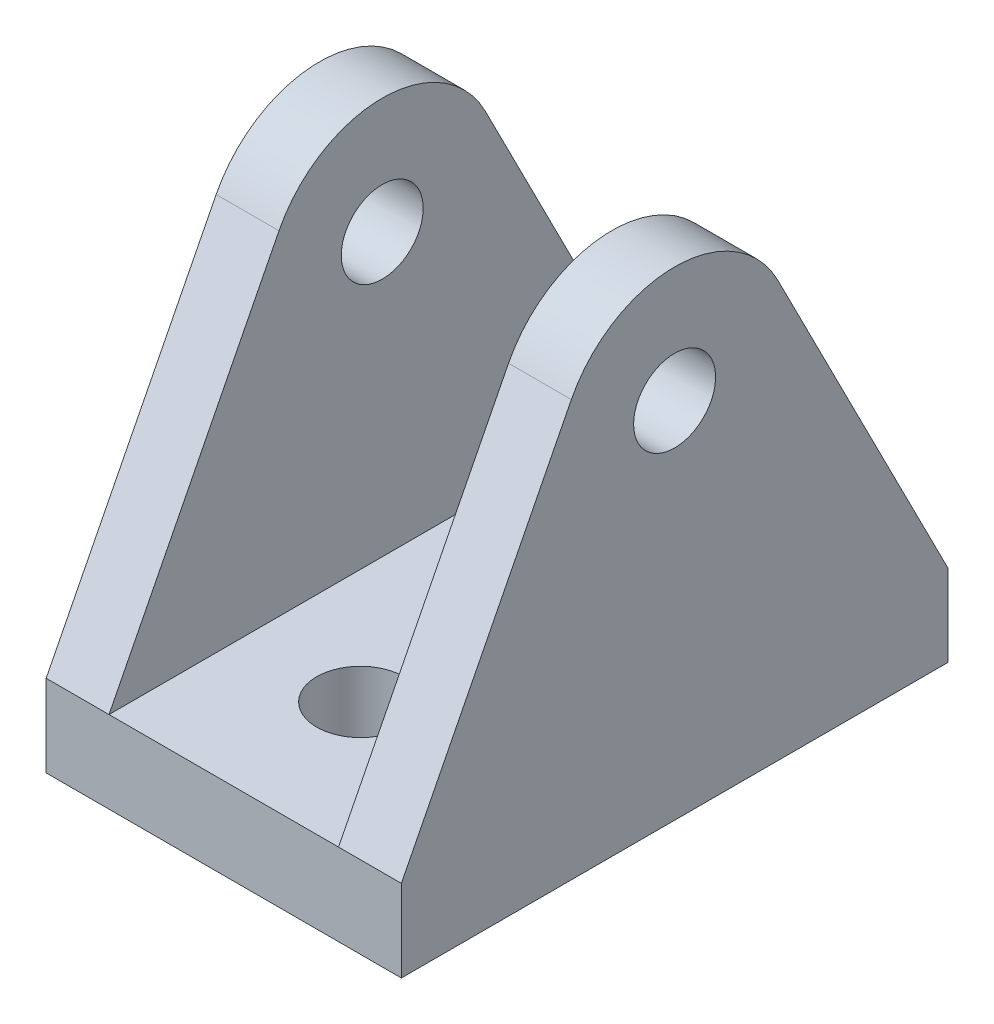
ISO-10303-21;
HEADER;
FILE_DESCRIPTION(('STEP AP214'),'2;1');
FILE_NAME('part.step','',(''),(''),'','','');
FILE_SCHEMA(('AUTOMOTIVE_DESIGN { 1 0 10303 214 1 1 1 1 }'));
ENDSEC;
DATA;
#1=APPLICATION_CONTEXT('core data for automotive mechanical design processes');
#2=APPLICATION_PROTOCOL_DEFINITION('international standard','automotive_design',2000,#1);
#3=PRODUCT_CONTEXT('',#1,'mechanical');
#4=PRODUCT('Part','Part','',(#3));
#5=PRODUCT_RELATED_PRODUCT_CATEGORY('part','',(#4));
#6=PRODUCT_DEFINITION_FORMATION('','',#4);
#7=PRODUCT_DEFINITION_CONTEXT('part definition',#1,'design');
#8=PRODUCT_DEFINITION('design','',#6,#7);
#9=PRODUCT_DEFINITION_SHAPE('','',#8);
#10=(LENGTH_UNIT() NAMED_UNIT(*) SI_UNIT(.MILLI.,.METRE.));
#11=(NAMED_UNIT(*) PLANE_ANGLE_UNIT() SI_UNIT($,.RADIAN.));
#12=(NAMED_UNIT(*) SI_UNIT($,.STERADIAN.) SOLID_ANGLE_UNIT());
#13=UNCERTAINTY_MEASURE_WITH_UNIT(LENGTH_MEASURE(1.E-05),#10,'distance_accuracy_value','');
#14=(GEOMETRIC_REPRESENTATION_CONTEXT(3) GLOBAL_UNCERTAINTY_ASSIGNED_CONTEXT((#13)) GLOBAL_UNIT_ASSIGNED_CONTEXT((#10,
#11,#12)) REPRESENTATION_CONTEXT('',''));
#15=CARTESIAN_POINT('',(0.,0.,0.));
#16=DIRECTION('',(0.,0.,1.));
#17=DIRECTION('',(1.,0.,0.));
#18=AXIS2_PLACEMENT_3D('',#15,#16,#17);
#19=CARTESIAN_POINT('',(31.2267385637492,3.,10.));
#20=DIRECTION('',(0.,0.453598301451091,0.891206250494623));
#21=DIRECTION('',(0.,-0.891206250494624,0.453598301451091));
#22=AXIS2_PLACEMENT_3D('',#19,#20,#21);
#23=PLANE('',#22);
#24=DIRECTION('',(0.,0.891206250494624,-0.453598301451091));
#25=VECTOR('',#24,1.);
#26=CARTESIAN_POINT('',(4.2,3.,10.));
#27=LINE('',#26,#25);
#28=CARTESIAN_POINT('',(4.2,3.,10.));
#29=VERTEX_POINT('',#28);
#30=CARTESIAN_POINT('',(4.2,15.2232567981526,3.7787145020972));
#31=VERTEX_POINT('',#30);
#32=EDGE_CURVE('E128',#29,#31,#27,.T.);
#33=ORIENTED_EDGE('',*,*,#32,.F.);
#34=DIRECTION('',(1.,0.,0.));
#35=VECTOR('',#34,1.);
#36=CARTESIAN_POINT('',(-6.5,3.,10.));
#37=LINE('',#36,#35);
#38=CARTESIAN_POINT('',(6.5,3.,10.));
#39=VERTEX_POINT('',#38);
#40=EDGE_CURVE('E150',#29,#39,#37,.T.);
#41=ORIENTED_EDGE('',*,*,#40,.T.);
#42=DIRECTION('',(0.,-0.891206250494624,0.453598301451091));
#43=VECTOR('',#42,1.);
#44=CARTESIAN_POINT('',(6.5,3.,10.));
#45=LINE('',#44,#43);
#46=CARTESIAN_POINT('',(6.5,15.2232567981526,3.7787145020972));
#47=VERTEX_POINT('',#46);
#48=EDGE_CURVE('E193',#47,#39,#45,.T.);
#49=ORIENTED_EDGE('',*,*,#48,.F.);
#50=DIRECTION('',(-1.,0.,0.));
#51=VECTOR('',#50,1.);
#52=CARTESIAN_POINT('',(31.2267385637492,15.2232567981526,3.7787145020972));
#53=LINE('',#52,#51);
#54=EDGE_CURVE('E147',#47,#31,#53,.T.);
#55=ORIENTED_EDGE('',*,*,#54,.T.);
#56=EDGE_LOOP('',(#33,#41,#49,#55));
#57=FACE_BOUND('',#56,.T.);
#58=ADVANCED_FACE('F39',(#57),#23,.T.);
#59=CARTESIAN_POINT('',(31.2267385637492,13.3,0.));
#60=DIRECTION('',(-1.,0.,0.));
#61=DIRECTION('',(0.,0.,1.));
#62=AXIS2_PLACEMENT_3D('',#59,#60,#61);
#63=CYLINDRICAL_SURFACE('',#62,4.24);
#64=DIRECTION('',(-1.,0.,0.));
#65=VECTOR('',#64,1.);
#66=CARTESIAN_POINT('',(31.2267385637492,15.2232567981526,-3.7787145020972));
#67=LINE('',#66,#65);
#68=CARTESIAN_POINT('',(6.5,15.2232567981526,-3.7787145020972));
#69=VERTEX_POINT('',#68);
#70=CARTESIAN_POINT('',(4.2,15.2232567981526,-3.7787145020972));
#71=VERTEX_POINT('',#70);
#72=EDGE_CURVE('E197',#69,#71,#67,.T.);
#73=ORIENTED_EDGE('',*,*,#72,.T.);
#74=CARTESIAN_POINT('',(4.2,13.3,0.));
#75=DIRECTION('',(1.,0.,0.));
#76=DIRECTION('',(0.,0.,-1.));
#77=AXIS2_PLACEMENT_3D('',#74,#75,#76);
#78=CIRCLE('',#77,4.24);
#79=EDGE_CURVE('E155',#31,#71,#78,.F.);
#80=ORIENTED_EDGE('',*,*,#79,.F.);
#81=ORIENTED_EDGE('',*,*,#54,.F.);
#82=CARTESIAN_POINT('',(6.5,13.3,0.));
#83=DIRECTION('',(-1.,0.,0.));
#84=DIRECTION('',(0.,0.,1.));
#85=AXIS2_PLACEMENT_3D('',#82,#83,#84);
#86=CIRCLE('',#85,4.24);
#87=EDGE_CURVE('E198',#69,#47,#86,.F.);
#88=ORIENTED_EDGE('',*,*,#87,.F.);
#89=EDGE_LOOP('',(#73,#80,#81,#88));
#90=FACE_BOUND('',#89,.T.);
#91=ADVANCED_FACE('F246',(#90),#63,.T.);
#92=CARTESIAN_POINT('',(31.2267385637492,3.,-10.));
#93=DIRECTION('',(0.,0.453598301451091,-0.891206250494623));
#94=DIRECTION('',(0.,0.891206250494624,0.453598301451091));
#95=AXIS2_PLACEMENT_3D('',#92,#93,#94);
#96=PLANE('',#95);
#97=DIRECTION('',(0.,-0.891206250494624,-0.453598301451091));
#98=VECTOR('',#97,1.);
#99=CARTESIAN_POINT('',(4.2,3.,-10.));
#100=LINE('',#99,#98);
#101=CARTESIAN_POINT('',(4.19999999999999,3.,-10.));
#102=VERTEX_POINT('',#101);
#103=EDGE_CURVE('E132',#71,#102,#100,.T.);
#104=ORIENTED_EDGE('',*,*,#103,.F.);
#105=ORIENTED_EDGE('',*,*,#72,.F.);
#106=DIRECTION('',(0.,0.891206250494624,0.453598301451091));
#107=VECTOR('',#106,1.);
#108=CARTESIAN_POINT('',(6.5,3.,-10.));
#109=LINE('',#108,#107);
#110=CARTESIAN_POINT('',(6.5,3.,-10.));
#111=VERTEX_POINT('',#110);
#112=EDGE_CURVE('E200',#111,#69,#109,.T.);
#113=ORIENTED_EDGE('',*,*,#112,.F.);
#114=DIRECTION('',(-1.,0.,0.));
#115=VECTOR('',#114,1.);
#116=CARTESIAN_POINT('',(-6.5,3.,-10.));
#117=LINE('',#116,#115);
#118=EDGE_CURVE('E164',#111,#102,#117,.T.);
#119=ORIENTED_EDGE('',*,*,#118,.T.);
#120=EDGE_LOOP('',(#104,#105,#113,#119));
#121=FACE_BOUND('',#120,.T.);
#122=ADVANCED_FACE('F251',(#121),#96,.T.);
#123=CARTESIAN_POINT('',(31.2267385637492,13.3,0.));
#124=DIRECTION('',(-1.,0.,0.));
#125=DIRECTION('',(0.,0.,1.));
#126=AXIS2_PLACEMENT_3D('',#123,#124,#125);
#127=CYLINDRICAL_SURFACE('',#126,1.5);
#128=CARTESIAN_POINT('',(4.2,13.3,0.));
#129=DIRECTION('',(1.,0.,0.));
#130=DIRECTION('',(0.,0.,-1.));
#131=AXIS2_PLACEMENT_3D('',#128,#129,#130);
#132=CIRCLE('',#131,1.5);
#133=CARTESIAN_POINT('',(4.2,13.3,-1.5));
#134=VERTEX_POINT('',#133);
#135=EDGE_CURVE('E43',#134,#134,#132,.F.);
#136=ORIENTED_EDGE('',*,*,#135,.T.);
#137=EDGE_LOOP('',(#136));
#138=FACE_BOUND('',#137,.T.);
#139=CARTESIAN_POINT('',(6.5,13.3,0.));
#140=DIRECTION('',(-1.,0.,0.));
#141=DIRECTION('',(0.,0.,1.));
#142=AXIS2_PLACEMENT_3D('',#139,#140,#141);
#143=CIRCLE('',#142,1.5);
#144=CARTESIAN_POINT('',(6.5,13.3,1.5));
#145=VERTEX_POINT('',#144);
#146=EDGE_CURVE('E203',#145,#145,#143,.F.);
#147=ORIENTED_EDGE('',*,*,#146,.T.);
#148=EDGE_LOOP('',(#147));
#149=FACE_BOUND('',#148,.T.);
#150=ADVANCED_FACE('F242',(#138,#149),#127,.F.);
#151=CARTESIAN_POINT('',(0.,0.,0.));
#152=DIRECTION('',(0.,1.,0.));
#153=DIRECTION('',(0.,0.,1.));
#154=AXIS2_PLACEMENT_3D('',#151,#152,#153);
#155=PLANE('',#154);
#156=DIRECTION('',(0.,0.,1.));
#157=VECTOR('',#156,1.);
#158=CARTESIAN_POINT('',(-6.5,0.,-10.));
#159=LINE('',#158,#157);
#160=CARTESIAN_POINT('',(-6.5,0.,-10.));
#161=VERTEX_POINT('',#160);
#162=CARTESIAN_POINT('',(-6.5,0.,10.));
#163=VERTEX_POINT('',#162);
#164=EDGE_CURVE('E166',#161,#163,#159,.T.);
#165=ORIENTED_EDGE('',*,*,#164,.F.);
#166=DIRECTION('',(-1.,0.,0.));
#167=VECTOR('',#166,1.);
#168=CARTESIAN_POINT('',(-6.5,0.,-10.));
#169=LINE('',#168,#167);
#170=CARTESIAN_POINT('',(6.5,0.,-10.));
#171=VERTEX_POINT('',#170);
#172=EDGE_CURVE('E84',#171,#161,#169,.T.);
#173=ORIENTED_EDGE('',*,*,#172,.F.);
#174=DIRECTION('',(0.,0.,-1.));
#175=VECTOR('',#174,1.);
#176=CARTESIAN_POINT('',(6.5,0.,-10.));
#177=LINE('',#176,#175);
#178=CARTESIAN_POINT('',(6.5,0.,10.));
#179=VERTEX_POINT('',#178);
#180=EDGE_CURVE('E157',#179,#171,#177,.T.);
#181=ORIENTED_EDGE('',*,*,#180,.F.);
#182=DIRECTION('',(1.,0.,0.));
#183=VECTOR('',#182,1.);
#184=CARTESIAN_POINT('',(-6.5,0.,10.));
#185=LINE('',#184,#183);
#186=EDGE_CURVE('E174',#163,#179,#185,.T.);
#187=ORIENTED_EDGE('',*,*,#186,.F.);
#188=EDGE_LOOP('',(#165,#173,#181,#187));
#189=FACE_BOUND('',#188,.T.);
#190=CARTESIAN_POINT('',(0.,0.,-5.));
#191=DIRECTION('',(0.,1.,0.));
#192=DIRECTION('',(0.,0.,1.));
#193=AXIS2_PLACEMENT_3D('',#190,#191,#192);
#194=CIRCLE('',#193,1.6);
#195=CARTESIAN_POINT('',(0.,0.,-3.4));
#196=VERTEX_POINT('',#195);
#197=EDGE_CURVE('E162',#196,#196,#194,.T.);
#198=ORIENTED_EDGE('',*,*,#197,.T.);
#199=EDGE_LOOP('',(#198));
#200=FACE_BOUND('',#199,.T.);
#201=CARTESIAN_POINT('',(0.,0.,5.));
#202=DIRECTION('',(0.,1.,0.));
#203=DIRECTION('',(0.,0.,-1.));
#204=AXIS2_PLACEMENT_3D('',#201,#202,#203);
#205=CIRCLE('',#204,1.6);
#206=CARTESIAN_POINT('',(0.,0.,3.4));
#207=VERTEX_POINT('',#206);
#208=EDGE_CURVE('E225',#207,#207,#205,.T.);
#209=ORIENTED_EDGE('',*,*,#208,.T.);
#210=EDGE_LOOP('',(#209));
#211=FACE_BOUND('',#210,.T.);
#212=ADVANCED_FACE('F284',(#189,#200,#211),#155,.F.);
#213=CARTESIAN_POINT('',(-6.5,3.,-10.));
#214=DIRECTION('',(1.,0.,0.));
#215=DIRECTION('',(0.,0.,-1.));
#216=AXIS2_PLACEMENT_3D('',#213,#214,#215);
#217=PLANE('',#216);
#218=ORIENTED_EDGE('',*,*,#164,.T.);
#219=DIRECTION('',(0.,-1.,0.));
#220=VECTOR('',#219,1.);
#221=CARTESIAN_POINT('',(-6.5,3.,10.));
#222=LINE('',#221,#220);
#223=CARTESIAN_POINT('',(-6.5,3.,10.));
#224=VERTEX_POINT('',#223);
#225=EDGE_CURVE('E11',#224,#163,#222,.T.);
#226=ORIENTED_EDGE('',*,*,#225,.F.);
#227=DIRECTION('',(0.,0.891206250494623,-0.453598301451091));
#228=VECTOR('',#227,1.);
#229=CARTESIAN_POINT('',(-6.5,3.,10.));
#230=LINE('',#229,#228);
#231=CARTESIAN_POINT('',(-6.5,15.2232567981526,3.7787145020972));
#232=VERTEX_POINT('',#231);
#233=EDGE_CURVE('E207',#224,#232,#230,.T.);
#234=ORIENTED_EDGE('',*,*,#233,.T.);
#235=CARTESIAN_POINT('',(-6.5,13.3,0.));
#236=DIRECTION('',(-1.,0.,0.));
#237=DIRECTION('',(0.,0.,-1.));
#238=AXIS2_PLACEMENT_3D('',#235,#236,#237);
#239=CIRCLE('',#238,4.24);
#240=CARTESIAN_POINT('',(-6.5,15.2232567981526,-3.7787145020972));
#241=VERTEX_POINT('',#240);
#242=EDGE_CURVE('E215',#232,#241,#239,.T.);
#243=ORIENTED_EDGE('',*,*,#242,.T.);
#244=DIRECTION('',(0.,-0.891206250494623,-0.453598301451091));
#245=VECTOR('',#244,1.);
#246=CARTESIAN_POINT('',(-6.5,3.,-10.));
#247=LINE('',#246,#245);
#248=CARTESIAN_POINT('',(-6.5,3.,-10.));
#249=VERTEX_POINT('',#248);
#250=EDGE_CURVE('E202',#241,#249,#247,.T.);
#251=ORIENTED_EDGE('',*,*,#250,.T.);
#252=DIRECTION('',(0.,-1.,0.));
#253=VECTOR('',#252,1.);
#254=CARTESIAN_POINT('',(-6.5,3.,-10.));
#255=LINE('',#254,#253);
#256=EDGE_CURVE('E169',#249,#161,#255,.T.);
#257=ORIENTED_EDGE('',*,*,#256,.T.);
#258=EDGE_LOOP('',(#218,#226,#234,#243,#251,#257));
#259=FACE_BOUND('',#258,.T.);
#260=CARTESIAN_POINT('',(-6.5,13.3,0.));
#261=DIRECTION('',(-1.,0.,0.));
#262=DIRECTION('',(0.,0.,1.));
#263=AXIS2_PLACEMENT_3D('',#260,#261,#262);
#264=CIRCLE('',#263,1.5);
#265=CARTESIAN_POINT('',(-6.5,13.3,1.5));
#266=VERTEX_POINT('',#265);
#267=EDGE_CURVE('E205',#266,#266,#264,.T.);
#268=ORIENTED_EDGE('',*,*,#267,.F.);
#269=EDGE_LOOP('',(#268));
#270=FACE_BOUND('',#269,.T.);
#271=ADVANCED_FACE('F41',(#259,#270),#217,.F.);
#272=CARTESIAN_POINT('',(-6.5,3.,10.));
#273=DIRECTION('',(0.,0.,-1.));
#274=DIRECTION('',(-1.,0.,0.));
#275=AXIS2_PLACEMENT_3D('',#272,#273,#274);
#276=PLANE('',#275);
#277=ORIENTED_EDGE('',*,*,#186,.T.);
#278=DIRECTION('',(0.,-1.,0.));
#279=VECTOR('',#278,1.);
#280=CARTESIAN_POINT('',(6.5,3.,10.));
#281=LINE('',#280,#279);
#282=EDGE_CURVE('E48',#39,#179,#281,.T.);
#283=ORIENTED_EDGE('',*,*,#282,.F.);
#284=ORIENTED_EDGE('',*,*,#40,.F.);
#285=DIRECTION('',(-1.,0.,0.));
#286=VECTOR('',#285,1.);
#287=CARTESIAN_POINT('',(4.2,3.,10.));
#288=LINE('',#287,#286);
#289=CARTESIAN_POINT('',(-4.2,3.,10.));
#290=VERTEX_POINT('',#289);
#291=EDGE_CURVE('E136',#29,#290,#288,.T.);
#292=ORIENTED_EDGE('',*,*,#291,.T.);
#293=EDGE_CURVE('E93',#224,#290,#37,.T.);
#294=ORIENTED_EDGE('',*,*,#293,.F.);
#295=ORIENTED_EDGE('',*,*,#225,.T.);
#296=EDGE_LOOP('',(#277,#283,#284,#292,#294,#295));
#297=FACE_BOUND('',#296,.T.);
#298=ADVANCED_FACE('F152',(#297),#276,.F.);
#299=CARTESIAN_POINT('',(6.5,3.,-10.));
#300=DIRECTION('',(-1.,0.,0.));
#301=DIRECTION('',(0.,0.,1.));
#302=AXIS2_PLACEMENT_3D('',#299,#300,#301);
#303=PLANE('',#302);
#304=ORIENTED_EDGE('',*,*,#180,.T.);
#305=DIRECTION('',(0.,-1.,0.));
#306=VECTOR('',#305,1.);
#307=CARTESIAN_POINT('',(6.5,3.,-10.));
#308=LINE('',#307,#306);
#309=EDGE_CURVE('E61',#111,#171,#308,.T.);
#310=ORIENTED_EDGE('',*,*,#309,.F.);
#311=ORIENTED_EDGE('',*,*,#112,.T.);
#312=ORIENTED_EDGE('',*,*,#87,.T.);
#313=ORIENTED_EDGE('',*,*,#48,.T.);
#314=ORIENTED_EDGE('',*,*,#282,.T.);
#315=EDGE_LOOP('',(#304,#310,#311,#312,#313,#314));
#316=FACE_BOUND('',#315,.T.);
#317=ORIENTED_EDGE('',*,*,#146,.F.);
#318=EDGE_LOOP('',(#317));
#319=FACE_BOUND('',#318,.T.);
#320=ADVANCED_FACE('F278',(#316,#319),#303,.F.);
#321=CARTESIAN_POINT('',(-6.5,3.,-10.));
#322=DIRECTION('',(0.,0.,1.));
#323=DIRECTION('',(1.,0.,0.));
#324=AXIS2_PLACEMENT_3D('',#321,#322,#323);
#325=PLANE('',#324);
#326=ORIENTED_EDGE('',*,*,#172,.T.);
#327=ORIENTED_EDGE('',*,*,#256,.F.);
#328=CARTESIAN_POINT('',(-4.2,3.,-10.));
#329=VERTEX_POINT('',#328);
#330=EDGE_CURVE('E158',#329,#249,#117,.T.);
#331=ORIENTED_EDGE('',*,*,#330,.F.);
#332=DIRECTION('',(-1.,0.,0.));
#333=VECTOR('',#332,1.);
#334=CARTESIAN_POINT('',(4.2,3.,-10.));
#335=LINE('',#334,#333);
#336=EDGE_CURVE('E142',#102,#329,#335,.T.);
#337=ORIENTED_EDGE('',*,*,#336,.F.);
#338=ORIENTED_EDGE('',*,*,#118,.F.);
#339=ORIENTED_EDGE('',*,*,#309,.T.);
#340=EDGE_LOOP('',(#326,#327,#331,#337,#338,#339));
#341=FACE_BOUND('',#340,.T.);
#342=ADVANCED_FACE('F295',(#341),#325,.F.);
#343=CARTESIAN_POINT('',(0.,3.,-5.));
#344=DIRECTION('',(0.,-1.,0.));
#345=DIRECTION('',(0.,0.,-1.));
#346=AXIS2_PLACEMENT_3D('',#343,#344,#345);
#347=CYLINDRICAL_SURFACE('',#346,1.6);
#348=CARTESIAN_POINT('',(0.,3.,-5.));
#349=DIRECTION('',(0.,1.,0.));
#350=DIRECTION('',(0.,0.,1.));
#351=AXIS2_PLACEMENT_3D('',#348,#349,#350);
#352=CIRCLE('',#351,1.6);
#353=CARTESIAN_POINT('',(0.,3.,-3.4));
#354=VERTEX_POINT('',#353);
#355=EDGE_CURVE('E151',#354,#354,#352,.T.);
#356=ORIENTED_EDGE('',*,*,#355,.T.);
#357=EDGE_LOOP('',(#356));
#358=FACE_BOUND('',#357,.T.);
#359=ORIENTED_EDGE('',*,*,#197,.F.);
#360=EDGE_LOOP('',(#359));
#361=FACE_BOUND('',#360,.T.);
#362=ADVANCED_FACE('F230',(#358,#361),#347,.F.);
#363=CARTESIAN_POINT('',(0.,3.,5.));
#364=DIRECTION('',(0.,-1.,0.));
#365=DIRECTION('',(0.,0.,-1.));
#366=AXIS2_PLACEMENT_3D('',#363,#364,#365);
#367=CYLINDRICAL_SURFACE('',#366,1.6);
#368=CARTESIAN_POINT('',(0.,3.,5.));
#369=DIRECTION('',(0.,1.,0.));
#370=DIRECTION('',(0.,0.,-1.));
#371=AXIS2_PLACEMENT_3D('',#368,#369,#370);
#372=CIRCLE('',#371,1.6);
#373=CARTESIAN_POINT('',(0.,3.,3.4));
#374=VERTEX_POINT('',#373);
#375=EDGE_CURVE('E206',#374,#374,#372,.T.);
#376=ORIENTED_EDGE('',*,*,#375,.T.);
#377=EDGE_LOOP('',(#376));
#378=FACE_BOUND('',#377,.T.);
#379=ORIENTED_EDGE('',*,*,#208,.F.);
#380=EDGE_LOOP('',(#379));
#381=FACE_BOUND('',#380,.T.);
#382=ADVANCED_FACE('F259',(#378,#381),#367,.F.);
#383=DIRECTION('',(0.,-0.891206250494624,0.453598301451091));
#384=VECTOR('',#383,1.);
#385=CARTESIAN_POINT('',(-4.2,3.,10.));
#386=LINE('',#385,#384);
#387=CARTESIAN_POINT('',(-4.2,15.2232567981526,3.7787145020972));
#388=VERTEX_POINT('',#387);
#389=EDGE_CURVE('E186',#388,#290,#386,.T.);
#390=ORIENTED_EDGE('',*,*,#389,.F.);
#391=EDGE_CURVE('E214',#388,#232,#53,.T.);
#392=ORIENTED_EDGE('',*,*,#391,.T.);
#393=ORIENTED_EDGE('',*,*,#233,.F.);
#394=ORIENTED_EDGE('',*,*,#293,.T.);
#395=EDGE_LOOP('',(#390,#392,#393,#394));
#396=FACE_BOUND('',#395,.T.);
#397=ADVANCED_FACE('F247',(#396),#23,.T.);
#398=CARTESIAN_POINT('',(-4.2,13.3,0.));
#399=DIRECTION('',(-1.,0.,0.));
#400=DIRECTION('',(0.,0.,1.));
#401=AXIS2_PLACEMENT_3D('',#398,#399,#400);
#402=CIRCLE('',#401,4.24);
#403=CARTESIAN_POINT('',(-4.2,15.2232567981526,-3.7787145020972));
#404=VERTEX_POINT('',#403);
#405=EDGE_CURVE('E181',#404,#388,#402,.F.);
#406=ORIENTED_EDGE('',*,*,#405,.F.);
#407=EDGE_CURVE('E217',#404,#241,#67,.T.);
#408=ORIENTED_EDGE('',*,*,#407,.T.);
#409=ORIENTED_EDGE('',*,*,#242,.F.);
#410=ORIENTED_EDGE('',*,*,#391,.F.);
#411=EDGE_LOOP('',(#406,#408,#409,#410));
#412=FACE_BOUND('',#411,.T.);
#413=ADVANCED_FACE('F258',(#412),#63,.T.);
#414=DIRECTION('',(0.,0.891206250494624,0.453598301451091));
#415=VECTOR('',#414,1.);
#416=CARTESIAN_POINT('',(-4.2,3.,-10.));
#417=LINE('',#416,#415);
#418=EDGE_CURVE('E178',#329,#404,#417,.T.);
#419=ORIENTED_EDGE('',*,*,#418,.F.);
#420=ORIENTED_EDGE('',*,*,#330,.T.);
#421=ORIENTED_EDGE('',*,*,#250,.F.);
#422=ORIENTED_EDGE('',*,*,#407,.F.);
#423=EDGE_LOOP('',(#419,#420,#421,#422));
#424=FACE_BOUND('',#423,.T.);
#425=ADVANCED_FACE('F243',(#424),#96,.T.);
#426=CARTESIAN_POINT('',(-4.2,13.3,0.));
#427=DIRECTION('',(-1.,0.,0.));
#428=DIRECTION('',(0.,0.,1.));
#429=AXIS2_PLACEMENT_3D('',#426,#427,#428);
#430=CIRCLE('',#429,1.5);
#431=CARTESIAN_POINT('',(-4.2,13.3,1.5));
#432=VERTEX_POINT('',#431);
#433=EDGE_CURVE('E180',#432,#432,#430,.F.);
#434=ORIENTED_EDGE('',*,*,#433,.T.);
#435=EDGE_LOOP('',(#434));
#436=FACE_BOUND('',#435,.T.);
#437=ORIENTED_EDGE('',*,*,#267,.T.);
#438=EDGE_LOOP('',(#437));
#439=FACE_BOUND('',#438,.T.);
#440=ADVANCED_FACE('F232',(#436,#439),#127,.F.);
#441=CARTESIAN_POINT('',(4.2,3.,10.));
#442=DIRECTION('',(0.,-1.,0.));
#443=DIRECTION('',(0.,0.,-1.));
#444=AXIS2_PLACEMENT_3D('',#441,#442,#443);
#445=PLANE('',#444);
#446=ORIENTED_EDGE('',*,*,#355,.F.);
#447=EDGE_LOOP('',(#446));
#448=FACE_BOUND('',#447,.T.);
#449=ORIENTED_EDGE('',*,*,#336,.T.);
#450=DIRECTION('',(0.,0.,-1.));
#451=VECTOR('',#450,1.);
#452=CARTESIAN_POINT('',(-4.2,3.,10.));
#453=LINE('',#452,#451);
#454=EDGE_CURVE('E131',#290,#329,#453,.T.);
#455=ORIENTED_EDGE('',*,*,#454,.F.);
#456=ORIENTED_EDGE('',*,*,#291,.F.);
#457=DIRECTION('',(0.,0.,-1.));
#458=VECTOR('',#457,1.);
#459=CARTESIAN_POINT('',(4.2,3.,10.));
#460=LINE('',#459,#458);
#461=EDGE_CURVE('E57',#29,#102,#460,.T.);
#462=ORIENTED_EDGE('',*,*,#461,.T.);
#463=EDGE_LOOP('',(#449,#455,#456,#462));
#464=FACE_BOUND('',#463,.T.);
#465=ORIENTED_EDGE('',*,*,#375,.F.);
#466=EDGE_LOOP('',(#465));
#467=FACE_BOUND('',#466,.T.);
#468=ADVANCED_FACE('F138',(#448,#464,#467),#445,.F.);
#469=CARTESIAN_POINT('',(4.2,3.,10.));
#470=DIRECTION('',(1.,0.,0.));
#471=DIRECTION('',(0.,0.,-1.));
#472=AXIS2_PLACEMENT_3D('',#469,#470,#471);
#473=PLANE('',#472);
#474=ORIENTED_EDGE('',*,*,#32,.T.);
#475=ORIENTED_EDGE('',*,*,#79,.T.);
#476=ORIENTED_EDGE('',*,*,#103,.T.);
#477=ORIENTED_EDGE('',*,*,#461,.F.);
#478=EDGE_LOOP('',(#474,#475,#476,#477));
#479=FACE_BOUND('',#478,.T.);
#480=ORIENTED_EDGE('',*,*,#135,.F.);
#481=EDGE_LOOP('',(#480));
#482=FACE_BOUND('',#481,.T.);
#483=ADVANCED_FACE('F130',(#479,#482),#473,.F.);
#484=CARTESIAN_POINT('',(-4.2,3.,10.));
#485=DIRECTION('',(-1.,0.,0.));
#486=DIRECTION('',(0.,0.,1.));
#487=AXIS2_PLACEMENT_3D('',#484,#485,#486);
#488=PLANE('',#487);
#489=ORIENTED_EDGE('',*,*,#389,.T.);
#490=ORIENTED_EDGE('',*,*,#454,.T.);
#491=ORIENTED_EDGE('',*,*,#418,.T.);
#492=ORIENTED_EDGE('',*,*,#405,.T.);
#493=EDGE_LOOP('',(#489,#490,#491,#492));
#494=FACE_BOUND('',#493,.T.);
#495=ORIENTED_EDGE('',*,*,#433,.F.);
#496=EDGE_LOOP('',(#495));
#497=FACE_BOUND('',#496,.T.);
#498=ADVANCED_FACE('F239',(#494,#497),#488,.F.);
#499=CLOSED_SHELL('',(#58,#91,#122,#150,#212,#271,#298,#320,#342,#362,#382,#397,#413,#425,#440,
#468,#483,#498));
#500=MANIFOLD_SOLID_BREP('B2',#499);
#501=ADVANCED_BREP_SHAPE_REPRESENTATION('',(#18,#500),#14);
#502=SHAPE_DEFINITION_REPRESENTATION(#9,#501);
ENDSEC;
END-ISO-10303-21;
